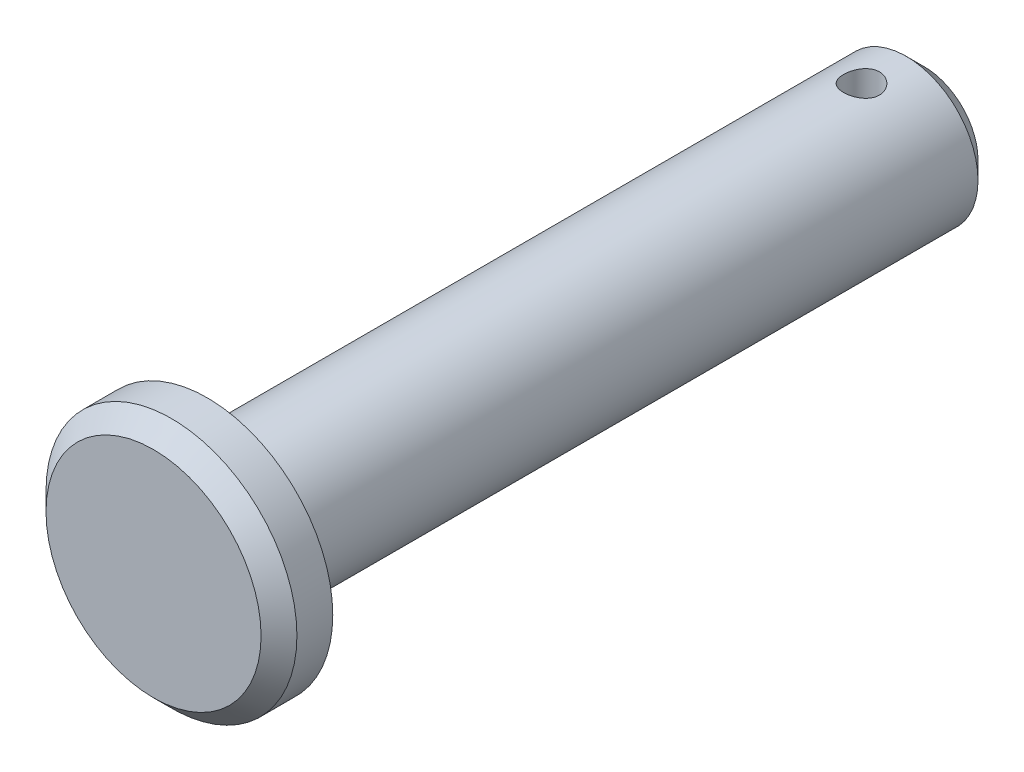
ISO-10303-21;
HEADER;
FILE_DESCRIPTION(('STEP AP214'),'2;1');
FILE_NAME('part.step','',(''),(''),'','','');
FILE_SCHEMA(('AUTOMOTIVE_DESIGN { 1 0 10303 214 1 1 1 1 }'));
ENDSEC;
DATA;
#1=APPLICATION_CONTEXT('core data for automotive mechanical design processes');
#2=APPLICATION_PROTOCOL_DEFINITION('international standard','automotive_design',2000,#1);
#3=PRODUCT_CONTEXT('',#1,'mechanical');
#4=PRODUCT('Part','Part','',(#3));
#5=PRODUCT_RELATED_PRODUCT_CATEGORY('part','',(#4));
#6=PRODUCT_DEFINITION_FORMATION('','',#4);
#7=PRODUCT_DEFINITION_CONTEXT('part definition',#1,'design');
#8=PRODUCT_DEFINITION('design','',#6,#7);
#9=PRODUCT_DEFINITION_SHAPE('','',#8);
#10=(LENGTH_UNIT() NAMED_UNIT(*) SI_UNIT(.MILLI.,.METRE.));
#11=(NAMED_UNIT(*) PLANE_ANGLE_UNIT() SI_UNIT($,.RADIAN.));
#12=(NAMED_UNIT(*) SI_UNIT($,.STERADIAN.) SOLID_ANGLE_UNIT());
#13=UNCERTAINTY_MEASURE_WITH_UNIT(LENGTH_MEASURE(1.E-05),#10,'distance_accuracy_value','');
#14=(GEOMETRIC_REPRESENTATION_CONTEXT(3) GLOBAL_UNCERTAINTY_ASSIGNED_CONTEXT((#13)) GLOBAL_UNIT_ASSIGNED_CONTEXT((#10,
#11,#12)) REPRESENTATION_CONTEXT('',''));
#15=CARTESIAN_POINT('',(0.,0.,0.));
#16=DIRECTION('',(0.,0.,1.));
#17=DIRECTION('',(1.,0.,0.));
#18=AXIS2_PLACEMENT_3D('',#15,#16,#17);
#19=CARTESIAN_POINT('',(0.,-20.1940334543548,3.5));
#20=DIRECTION('',(0.,1.,0.));
#21=DIRECTION('',(0.,0.,1.));
#22=AXIS2_PLACEMENT_3D('',#19,#20,#21);
#23=CYLINDRICAL_SURFACE('',#22,1.);
#24=CARTESIAN_POINT('',(0.,-4.,4.5));
#25=CARTESIAN_POINT('',(-0.0552507257798206,-3.99999906578675,4.49999844950789));
#26=CARTESIAN_POINT('',(-0.110518771887175,-3.99884385421219,4.49540563281747));
#27=CARTESIAN_POINT('',(-0.219470882513688,-3.99434742553262,4.477183232462));
#28=CARTESIAN_POINT('',(-0.27315403124716,-3.99100496946647,4.46354852697477));
#29=CARTESIAN_POINT('',(-0.377347248121717,-3.98250417554694,4.42770716435861));
#30=CARTESIAN_POINT('',(-0.427861042286667,-3.97734801894725,4.40551080085648));
#31=CARTESIAN_POINT('',(-0.524448087936283,-3.96576895871729,4.35321240663678));
#32=CARTESIAN_POINT('',(-0.570521189565839,-3.95934601236034,4.32311010925404));
#33=CARTESIAN_POINT('',(-0.657867951533947,-3.94578275727868,4.25519947356386));
#34=CARTESIAN_POINT('',(-0.699037126707381,-3.93863138099022,4.21725895002722));
#35=CARTESIAN_POINT('',(-0.774499284802202,-3.92449080078353,4.13503186339406));
#36=CARTESIAN_POINT('',(-0.808791491299423,-3.91750161525566,4.09074458470233));
#37=CARTESIAN_POINT('',(-0.870017695199355,-3.90436517133141,3.99626984884171));
#38=CARTESIAN_POINT('',(-0.896834810616904,-3.89823196313737,3.94600451279306));
#39=CARTESIAN_POINT('',(-0.941597939033685,-3.88766329874815,3.84150105889443));
#40=CARTESIAN_POINT('',(-0.959545370292889,-3.88322757115193,3.78726357778283));
#41=CARTESIAN_POINT('',(-0.985703224536194,-3.87666984478368,3.67750433453168));
#42=CARTESIAN_POINT('',(-0.994101512222225,-3.87450327383617,3.62203006930014));
#43=CARTESIAN_POINT('',(-1.00150785004523,-3.87259575025161,3.51042095399068));
#44=CARTESIAN_POINT('',(-1.00051742787865,-3.87285440299097,3.4542862128676));
#45=CARTESIAN_POINT('',(-0.989324349759521,-3.87572803664413,3.34438946150368));
#46=CARTESIAN_POINT('',(-0.979345560127013,-3.87828575334586,3.29060291902327));
#47=CARTESIAN_POINT('',(-0.950816124602071,-3.88537806450989,3.1854926327258));
#48=CARTESIAN_POINT('',(-0.932264868046283,-3.88991279980465,3.13416906464734));
#49=CARTESIAN_POINT('',(-0.886926318624769,-3.90050075936126,3.03484132249862));
#50=CARTESIAN_POINT('',(-0.860057778155272,-3.90656884979614,2.98687588547363));
#51=CARTESIAN_POINT('',(-0.798904184009968,-3.91953140564257,2.89605419349544));
#52=CARTESIAN_POINT('',(-0.764617832539226,-3.92642601556491,2.85319883462183));
#53=CARTESIAN_POINT('',(-0.688442283120812,-3.94050587026522,2.7725309228704));
#54=CARTESIAN_POINT('',(-0.646364172110573,-3.94769379651981,2.73489700662577));
#55=CARTESIAN_POINT('',(-0.556407945002465,-3.96137310385857,2.6671858383574));
#56=CARTESIAN_POINT('',(-0.508529651805295,-3.96786446366278,2.63710881715762));
#57=CARTESIAN_POINT('',(-0.408077259120927,-3.97945154729456,2.58529960918374));
#58=CARTESIAN_POINT('',(-0.355487595472414,-3.9845424008515,2.56359643983038));
#59=CARTESIAN_POINT('',(-0.247250672095254,-3.99271944660946,2.52938846286028));
#60=CARTESIAN_POINT('',(-0.191603999433656,-3.99580602226188,2.51688189572124));
#61=CARTESIAN_POINT('',(-0.080359980260018,-3.9995699951425,2.50169495629411));
#62=CARTESIAN_POINT('',(-0.0247978133254733,-4.00030702338852,2.4987713159498));
#63=CARTESIAN_POINT('',(0.0860219165343387,-3.99945869876301,2.50216600137033));
#64=CARTESIAN_POINT('',(0.14127950642973,-3.99787355494565,2.50848349519942));
#65=CARTESIAN_POINT('',(0.249076179184328,-3.99259720751572,2.52998060559425));
#66=CARTESIAN_POINT('',(0.301643412645835,-3.98893756123874,2.54502750898466));
#67=CARTESIAN_POINT('',(0.403504861635007,-3.97992471089423,2.58340472268563));
#68=CARTESIAN_POINT('',(0.452798746021757,-3.97457133579929,2.60673586954211));
#69=CARTESIAN_POINT('',(0.547682089619898,-3.96262205284208,2.66149075258315));
#70=CARTESIAN_POINT('',(0.593190294557219,-3.95600578244621,2.69305074159784));
#71=CARTESIAN_POINT('',(0.678351075762163,-3.94229672791613,2.76319327253131));
#72=CARTESIAN_POINT('',(0.718002639315339,-3.93520386167804,2.80177702641127));
#73=CARTESIAN_POINT('',(0.791327045381821,-3.92112637973848,2.88600130722964));
#74=CARTESIAN_POINT('',(0.824829245081355,-3.91414869458187,2.93179180200161));
#75=CARTESIAN_POINT('',(0.883673839341798,-3.90128585584826,3.02848842297714));
#76=CARTESIAN_POINT('',(0.909016596105291,-3.89540065378019,3.07939432197317));
#77=CARTESIAN_POINT('',(0.950634280406194,-3.88545396489778,3.18460381494206));
#78=CARTESIAN_POINT('',(0.96696293110271,-3.88138170194604,3.23888508556267));
#79=CARTESIAN_POINT('',(0.990230439969186,-3.87551162726789,3.34953975859274));
#80=CARTESIAN_POINT('',(0.997171351652439,-3.87371331813292,3.40591270068833));
#81=CARTESIAN_POINT('',(1.00135906022266,-3.87263267469306,3.51741401590347));
#82=CARTESIAN_POINT('',(0.998878598520078,-3.87327955152176,3.57253162341649));
#83=CARTESIAN_POINT('',(0.984918185541911,-3.87685272671895,3.68153592577866));
#84=CARTESIAN_POINT('',(0.973438415124512,-3.87977897927905,3.73542264534243));
#85=CARTESIAN_POINT('',(0.941954212961862,-3.88754173788483,3.84013897271027));
#86=CARTESIAN_POINT('',(0.922000936453582,-3.89236676824206,3.89098487016014));
#87=CARTESIAN_POINT('',(0.874176609070046,-3.90338503816552,3.9886435884758));
#88=CARTESIAN_POINT('',(0.846304460022792,-3.90957846747183,4.03545584879128));
#89=CARTESIAN_POINT('',(0.782578499091423,-3.92283756175676,4.12503641933468));
#90=CARTESIAN_POINT('',(0.746535441941501,-3.92992176554505,4.16766738228264));
#91=CARTESIAN_POINT('',(0.667859580793155,-3.94405351497524,4.24636469653027));
#92=CARTESIAN_POINT('',(0.625225214174096,-3.95110105151374,4.28242948674198));
#93=CARTESIAN_POINT('',(0.533645057801726,-3.96451770431776,4.34760753904307));
#94=CARTESIAN_POINT('',(0.484598948210923,-3.97087222243912,4.37658307578105));
#95=CARTESIAN_POINT('',(0.382177373006983,-3.98203283316746,4.42583164196035));
#96=CARTESIAN_POINT('',(0.328805042291159,-3.98684003466522,4.44611090709902));
#97=CARTESIAN_POINT('',(0.229606835495648,-3.99365373043695,4.47438122021977));
#98=CARTESIAN_POINT('',(0.184253447272046,-3.99601723368461,4.48396749536896));
#99=CARTESIAN_POINT('',(0.0926040476908554,-3.99919070154632,4.49677729574796));
#100=CARTESIAN_POINT('',(0.0463081074950775,-4.00000078300596,4.50000129953687));
#101=CARTESIAN_POINT('',(0.,-4.,4.5));
#102=B_SPLINE_CURVE_WITH_KNOTS('',3,(#24,#25,#26,#27,#28,#29,#30,#31,#32,#33,#34,#35,#36,#37,
#38,#39,#40,#41,#42,#43,#44,#45,#46,#47,#48,#49,#50,#51,#52,#53,#54,#55,#56,#57,#58,#59,#60,#61,
#62,#63,#64,#65,#66,#67,#68,#69,#70,#71,#72,#73,#74,#75,#76,#77,#78,#79,#80,#81,#82,#83,#84,#85,
#86,#87,#88,#89,#90,#91,#92,#93,#94,#95,#96,#97,#98,#99,#100,#101),.UNSPECIFIED.,.T.,.F.,(4,2,2,
2,2,2,2,2,2,2,2,2,2,2,2,2,2,2,2,2,2,2,2,2,2,2,2,2,2,2,2,2,2,2,2,2,2,2,4),(0.,0.165582474981259,
0.331258825175932,0.496736601524069,0.662219960112883,0.83076290291426,0.99932486386708,
1.17039098363871,1.34142974112912,1.50904196732953,1.67662692075131,1.84014998004679,
2.00368468977359,2.16887018582586,2.33408460557442,2.50401000646013,2.67394059705498,
2.84445486006076,3.01493649125762,3.18105539299517,3.34715934075162,3.51080183009358,
3.67446084881527,3.84102391710235,4.00761575338679,4.17829672802984,4.34897012499672,
4.51861503076025,4.68822282168272,4.85295853599075,5.0176909397069,5.18144267039632,
5.34521712091268,5.51326384273274,5.68135046513612,5.85248123666392,6.02348909214233,
6.16228161961433,6.3010637069536),.UNSPECIFIED.);
#103=CARTESIAN_POINT('',(0.,-4.,4.5));
#104=VERTEX_POINT('',#103);
#105=EDGE_CURVE('E19',#104,#104,#102,.F.);
#106=ORIENTED_EDGE('',*,*,#105,.F.);
#107=EDGE_LOOP('',(#106));
#108=FACE_BOUND('',#107,.T.);
#109=CARTESIAN_POINT('',(0.,4.,4.5));
#110=CARTESIAN_POINT('',(0.0552507257798206,3.99999906578675,4.49999844950789));
#111=CARTESIAN_POINT('',(0.110518771887175,3.99884385421219,4.49540563281747));
#112=CARTESIAN_POINT('',(0.219470882513688,3.99434742553262,4.477183232462));
#113=CARTESIAN_POINT('',(0.27315403124716,3.99100496946647,4.46354852697477));
#114=CARTESIAN_POINT('',(0.377347248121717,3.98250417554694,4.42770716435861));
#115=CARTESIAN_POINT('',(0.427861042286667,3.97734801894725,4.40551080085648));
#116=CARTESIAN_POINT('',(0.524448087936283,3.96576895871729,4.35321240663678));
#117=CARTESIAN_POINT('',(0.570521189565839,3.95934601236034,4.32311010925404));
#118=CARTESIAN_POINT('',(0.657867951533947,3.94578275727868,4.25519947356386));
#119=CARTESIAN_POINT('',(0.699037126707381,3.93863138099022,4.21725895002722));
#120=CARTESIAN_POINT('',(0.774499284802202,3.92449080078353,4.13503186339406));
#121=CARTESIAN_POINT('',(0.808791491299423,3.91750161525566,4.09074458470233));
#122=CARTESIAN_POINT('',(0.870017695199355,3.90436517133141,3.99626984884171));
#123=CARTESIAN_POINT('',(0.896834810616904,3.89823196313737,3.94600451279306));
#124=CARTESIAN_POINT('',(0.941597939033685,3.88766329874815,3.84150105889443));
#125=CARTESIAN_POINT('',(0.959545370292889,3.88322757115193,3.78726357778283));
#126=CARTESIAN_POINT('',(0.985703224536194,3.87666984478368,3.67750433453168));
#127=CARTESIAN_POINT('',(0.994101512222225,3.87450327383617,3.62203006930014));
#128=CARTESIAN_POINT('',(1.00150785004523,3.87259575025161,3.51042095399068));
#129=CARTESIAN_POINT('',(1.00051742787865,3.87285440299097,3.4542862128676));
#130=CARTESIAN_POINT('',(0.989324349759521,3.87572803664413,3.34438946150368));
#131=CARTESIAN_POINT('',(0.979345560127013,3.87828575334586,3.29060291902327));
#132=CARTESIAN_POINT('',(0.950816124602071,3.88537806450989,3.1854926327258));
#133=CARTESIAN_POINT('',(0.932264868046283,3.88991279980465,3.13416906464734));
#134=CARTESIAN_POINT('',(0.886926318624769,3.90050075936126,3.03484132249862));
#135=CARTESIAN_POINT('',(0.860057778155272,3.90656884979614,2.98687588547363));
#136=CARTESIAN_POINT('',(0.798904184009968,3.91953140564257,2.89605419349544));
#137=CARTESIAN_POINT('',(0.764617832539226,3.92642601556491,2.85319883462183));
#138=CARTESIAN_POINT('',(0.688442283120812,3.94050587026522,2.7725309228704));
#139=CARTESIAN_POINT('',(0.646364172110573,3.94769379651981,2.73489700662577));
#140=CARTESIAN_POINT('',(0.556407945002465,3.96137310385857,2.6671858383574));
#141=CARTESIAN_POINT('',(0.508529651805295,3.96786446366278,2.63710881715762));
#142=CARTESIAN_POINT('',(0.408077259120927,3.97945154729456,2.58529960918374));
#143=CARTESIAN_POINT('',(0.355487595472414,3.9845424008515,2.56359643983038));
#144=CARTESIAN_POINT('',(0.247250672095254,3.99271944660946,2.52938846286028));
#145=CARTESIAN_POINT('',(0.191603999433656,3.99580602226188,2.51688189572124));
#146=CARTESIAN_POINT('',(0.080359980260018,3.9995699951425,2.50169495629411));
#147=CARTESIAN_POINT('',(0.0247978133254733,4.00030702338852,2.4987713159498));
#148=CARTESIAN_POINT('',(-0.0860219165343387,3.99945869876301,2.50216600137033));
#149=CARTESIAN_POINT('',(-0.14127950642973,3.99787355494565,2.50848349519942));
#150=CARTESIAN_POINT('',(-0.249076179184328,3.99259720751572,2.52998060559425));
#151=CARTESIAN_POINT('',(-0.301643412645835,3.98893756123874,2.54502750898466));
#152=CARTESIAN_POINT('',(-0.403504861635007,3.97992471089423,2.58340472268563));
#153=CARTESIAN_POINT('',(-0.452798746021757,3.97457133579929,2.60673586954211));
#154=CARTESIAN_POINT('',(-0.547682089619898,3.96262205284208,2.66149075258315));
#155=CARTESIAN_POINT('',(-0.593190294557219,3.95600578244621,2.69305074159784));
#156=CARTESIAN_POINT('',(-0.678351075762163,3.94229672791613,2.76319327253131));
#157=CARTESIAN_POINT('',(-0.718002639315339,3.93520386167804,2.80177702641127));
#158=CARTESIAN_POINT('',(-0.791327045381821,3.92112637973848,2.88600130722964));
#159=CARTESIAN_POINT('',(-0.824829245081355,3.91414869458187,2.93179180200161));
#160=CARTESIAN_POINT('',(-0.883673839341798,3.90128585584826,3.02848842297714));
#161=CARTESIAN_POINT('',(-0.909016596105291,3.89540065378019,3.07939432197317));
#162=CARTESIAN_POINT('',(-0.950634280406194,3.88545396489778,3.18460381494206));
#163=CARTESIAN_POINT('',(-0.96696293110271,3.88138170194604,3.23888508556267));
#164=CARTESIAN_POINT('',(-0.990230439969186,3.87551162726789,3.34953975859274));
#165=CARTESIAN_POINT('',(-0.997171351652439,3.87371331813292,3.40591270068833));
#166=CARTESIAN_POINT('',(-1.00135906022266,3.87263267469306,3.51741401590347));
#167=CARTESIAN_POINT('',(-0.998878598520078,3.87327955152176,3.57253162341649));
#168=CARTESIAN_POINT('',(-0.984918185541911,3.87685272671895,3.68153592577866));
#169=CARTESIAN_POINT('',(-0.973438415124512,3.87977897927905,3.73542264534243));
#170=CARTESIAN_POINT('',(-0.941954212961862,3.88754173788483,3.84013897271027));
#171=CARTESIAN_POINT('',(-0.922000936453582,3.89236676824206,3.89098487016014));
#172=CARTESIAN_POINT('',(-0.874176609070046,3.90338503816552,3.9886435884758));
#173=CARTESIAN_POINT('',(-0.846304460022792,3.90957846747183,4.03545584879128));
#174=CARTESIAN_POINT('',(-0.782578499091423,3.92283756175676,4.12503641933468));
#175=CARTESIAN_POINT('',(-0.746535441941501,3.92992176554505,4.16766738228264));
#176=CARTESIAN_POINT('',(-0.667859580793155,3.94405351497524,4.24636469653027));
#177=CARTESIAN_POINT('',(-0.625225214174096,3.95110105151374,4.28242948674198));
#178=CARTESIAN_POINT('',(-0.533645057801726,3.96451770431776,4.34760753904307));
#179=CARTESIAN_POINT('',(-0.484598948210923,3.97087222243912,4.37658307578105));
#180=CARTESIAN_POINT('',(-0.382177373006983,3.98203283316746,4.42583164196035));
#181=CARTESIAN_POINT('',(-0.328805042291159,3.98684003466522,4.44611090709902));
#182=CARTESIAN_POINT('',(-0.229606835495648,3.99365373043695,4.47438122021977));
#183=CARTESIAN_POINT('',(-0.184253447272046,3.99601723368461,4.48396749536896));
#184=CARTESIAN_POINT('',(-0.0926040476908554,3.99919070154632,4.49677729574796));
#185=CARTESIAN_POINT('',(-0.0463081074950775,4.00000078300596,4.50000129953687));
#186=CARTESIAN_POINT('',(0.,4.,4.5));
#187=B_SPLINE_CURVE_WITH_KNOTS('',3,(#109,#110,#111,#112,#113,#114,#115,#116,#117,#118,#119,
#120,#121,#122,#123,#124,#125,#126,#127,#128,#129,#130,#131,#132,#133,#134,#135,#136,#137,#138,
#139,#140,#141,#142,#143,#144,#145,#146,#147,#148,#149,#150,#151,#152,#153,#154,#155,#156,#157,
#158,#159,#160,#161,#162,#163,#164,#165,#166,#167,#168,#169,#170,#171,#172,#173,#174,#175,#176,
#177,#178,#179,#180,#181,#182,#183,#184,#185,#186),.UNSPECIFIED.,.T.,.F.,(4,2,2,2,2,2,2,2,2,2,2,
2,2,2,2,2,2,2,2,2,2,2,2,2,2,2,2,2,2,2,2,2,2,2,2,2,2,2,4),(0.,0.165582474981259,
0.331258825175932,0.496736601524069,0.662219960112883,0.83076290291426,0.99932486386708,
1.17039098363871,1.34142974112912,1.50904196732953,1.67662692075131,1.84014998004679,
2.00368468977359,2.16887018582586,2.33408460557442,2.50401000646013,2.67394059705498,
2.84445486006076,3.01493649125762,3.18105539299517,3.34715934075162,3.51080183009358,
3.67446084881527,3.84102391710235,4.00761575338679,4.17829672802984,4.34897012499672,
4.51861503076025,4.68822282168272,4.85295853599075,5.0176909397069,5.18144267039632,
5.34521712091268,5.51326384273274,5.68135046513612,5.85248123666392,6.02348909214233,
6.16228161961433,6.3010637069536),.UNSPECIFIED.);
#188=CARTESIAN_POINT('',(0.,4.,4.5));
#189=VERTEX_POINT('',#188);
#190=EDGE_CURVE('E43',#189,#189,#187,.F.);
#191=ORIENTED_EDGE('',*,*,#190,.F.);
#192=EDGE_LOOP('',(#191));
#193=FACE_BOUND('',#192,.T.);
#194=ADVANCED_FACE('F15',(#108,#193),#23,.F.);
#195=CARTESIAN_POINT('',(0.,0.,43.));
#196=DIRECTION('',(0.,0.,-1.));
#197=DIRECTION('',(-1.,0.,0.));
#198=AXIS2_PLACEMENT_3D('',#195,#196,#197);
#199=CONICAL_SURFACE('',#198,6.,0.785398163397448);
#200=CARTESIAN_POINT('',(0.,0.,43.));
#201=DIRECTION('',(0.,0.,1.));
#202=DIRECTION('',(-1.,0.,0.));
#203=AXIS2_PLACEMENT_3D('',#200,#201,#202);
#204=CIRCLE('',#203,6.);
#205=CARTESIAN_POINT('',(-6.,0.,43.));
#206=VERTEX_POINT('',#205);
#207=EDGE_CURVE('E10',#206,#206,#204,.T.);
#208=ORIENTED_EDGE('',*,*,#207,.F.);
#209=EDGE_LOOP('',(#208));
#210=FACE_BOUND('',#209,.T.);
#211=CARTESIAN_POINT('',(0.,0.,42.));
#212=DIRECTION('',(0.,0.,-1.));
#213=DIRECTION('',(-1.,0.,0.));
#214=AXIS2_PLACEMENT_3D('',#211,#212,#213);
#215=CIRCLE('',#214,7.);
#216=CARTESIAN_POINT('',(-7.,0.,42.));
#217=VERTEX_POINT('',#216);
#218=EDGE_CURVE('E29',#217,#217,#215,.T.);
#219=ORIENTED_EDGE('',*,*,#218,.F.);
#220=EDGE_LOOP('',(#219));
#221=FACE_BOUND('',#220,.T.);
#222=ADVANCED_FACE('F56',(#210,#221),#199,.T.);
#223=CARTESIAN_POINT('',(0.,0.,1.));
#224=DIRECTION('',(0.,0.,1.));
#225=DIRECTION('',(1.,0.,0.));
#226=AXIS2_PLACEMENT_3D('',#223,#224,#225);
#227=CONICAL_SURFACE('',#226,4.,0.785398163397448);
#228=CARTESIAN_POINT('',(0.,0.,1.));
#229=DIRECTION('',(0.,0.,1.));
#230=DIRECTION('',(1.,0.,0.));
#231=AXIS2_PLACEMENT_3D('',#228,#229,#230);
#232=CIRCLE('',#231,4.);
#233=CARTESIAN_POINT('',(4.,0.,1.));
#234=VERTEX_POINT('',#233);
#235=EDGE_CURVE('E49',#234,#234,#232,.T.);
#236=ORIENTED_EDGE('',*,*,#235,.F.);
#237=EDGE_LOOP('',(#236));
#238=FACE_BOUND('',#237,.T.);
#239=CARTESIAN_POINT('',(0.,0.,0.));
#240=DIRECTION('',(0.,0.,-1.));
#241=DIRECTION('',(1.,0.,0.));
#242=AXIS2_PLACEMENT_3D('',#239,#240,#241);
#243=CIRCLE('',#242,3.);
#244=CARTESIAN_POINT('',(3.,0.,0.));
#245=VERTEX_POINT('',#244);
#246=EDGE_CURVE('E82',#245,#245,#243,.T.);
#247=ORIENTED_EDGE('',*,*,#246,.F.);
#248=EDGE_LOOP('',(#247));
#249=FACE_BOUND('',#248,.T.);
#250=ADVANCED_FACE('F17',(#238,#249),#227,.T.);
#251=CARTESIAN_POINT('',(7.,0.,43.));
#252=DIRECTION('',(0.,0.,-1.));
#253=DIRECTION('',(0.,-1.,0.));
#254=AXIS2_PLACEMENT_3D('',#251,#252,#253);
#255=PLANE('',#254);
#256=ORIENTED_EDGE('',*,*,#207,.T.);
#257=EDGE_LOOP('',(#256));
#258=FACE_BOUND('',#257,.T.);
#259=ADVANCED_FACE('F63',(#258),#255,.F.);
#260=CARTESIAN_POINT('',(0.,0.,53.));
#261=DIRECTION('',(0.,0.,1.));
#262=DIRECTION('',(1.,0.,0.));
#263=AXIS2_PLACEMENT_3D('',#260,#261,#262);
#264=CYLINDRICAL_SURFACE('',#263,7.);
#265=CARTESIAN_POINT('',(0.,0.,40.));
#266=DIRECTION('',(0.,0.,1.));
#267=DIRECTION('',(1.,0.,0.));
#268=AXIS2_PLACEMENT_3D('',#265,#266,#267);
#269=CIRCLE('',#268,7.);
#270=CARTESIAN_POINT('',(7.,0.,40.));
#271=VERTEX_POINT('',#270);
#272=EDGE_CURVE('E39',#271,#271,#269,.T.);
#273=ORIENTED_EDGE('',*,*,#272,.T.);
#274=EDGE_LOOP('',(#273));
#275=FACE_BOUND('',#274,.T.);
#276=ORIENTED_EDGE('',*,*,#218,.T.);
#277=EDGE_LOOP('',(#276));
#278=FACE_BOUND('',#277,.T.);
#279=ADVANCED_FACE('F61',(#275,#278),#264,.T.);
#280=CARTESIAN_POINT('',(4.,0.,40.));
#281=DIRECTION('',(0.,0.,1.));
#282=DIRECTION('',(1.,0.,0.));
#283=AXIS2_PLACEMENT_3D('',#280,#281,#282);
#284=PLANE('',#283);
#285=CARTESIAN_POINT('',(0.,0.,40.));
#286=DIRECTION('',(0.,0.,1.));
#287=DIRECTION('',(1.,0.,0.));
#288=AXIS2_PLACEMENT_3D('',#285,#286,#287);
#289=CIRCLE('',#288,4.);
#290=CARTESIAN_POINT('',(4.,0.,40.));
#291=VERTEX_POINT('',#290);
#292=EDGE_CURVE('E92',#291,#291,#289,.T.);
#293=ORIENTED_EDGE('',*,*,#292,.T.);
#294=EDGE_LOOP('',(#293));
#295=FACE_BOUND('',#294,.T.);
#296=ORIENTED_EDGE('',*,*,#272,.F.);
#297=EDGE_LOOP('',(#296));
#298=FACE_BOUND('',#297,.T.);
#299=ADVANCED_FACE('F58',(#295,#298),#284,.F.);
#300=CARTESIAN_POINT('',(0.,0.,53.));
#301=DIRECTION('',(0.,0.,1.));
#302=DIRECTION('',(1.,0.,0.));
#303=AXIS2_PLACEMENT_3D('',#300,#301,#302);
#304=CYLINDRICAL_SURFACE('',#303,4.);
#305=ORIENTED_EDGE('',*,*,#292,.F.);
#306=EDGE_LOOP('',(#305));
#307=FACE_BOUND('',#306,.T.);
#308=ORIENTED_EDGE('',*,*,#235,.T.);
#309=EDGE_LOOP('',(#308));
#310=FACE_BOUND('',#309,.T.);
#311=ORIENTED_EDGE('',*,*,#190,.T.);
#312=EDGE_LOOP('',(#311));
#313=FACE_BOUND('',#312,.T.);
#314=ORIENTED_EDGE('',*,*,#105,.T.);
#315=EDGE_LOOP('',(#314));
#316=FACE_BOUND('',#315,.T.);
#317=ADVANCED_FACE('F50',(#307,#310,#313,#316),#304,.T.);
#318=CARTESIAN_POINT('',(0.,0.,0.));
#319=DIRECTION('',(0.,0.,1.));
#320=DIRECTION('',(1.,0.,0.));
#321=AXIS2_PLACEMENT_3D('',#318,#319,#320);
#322=PLANE('',#321);
#323=ORIENTED_EDGE('',*,*,#246,.T.);
#324=EDGE_LOOP('',(#323));
#325=FACE_BOUND('',#324,.T.);
#326=ADVANCED_FACE('F135',(#325),#322,.F.);
#327=CLOSED_SHELL('',(#194,#222,#250,#259,#279,#299,#317,#326));
#328=MANIFOLD_SOLID_BREP('B1',#327);
#329=ADVANCED_BREP_SHAPE_REPRESENTATION('',(#18,#328),#14);
#330=SHAPE_DEFINITION_REPRESENTATION(#9,#329);
ENDSEC;
END-ISO-10303-21;
